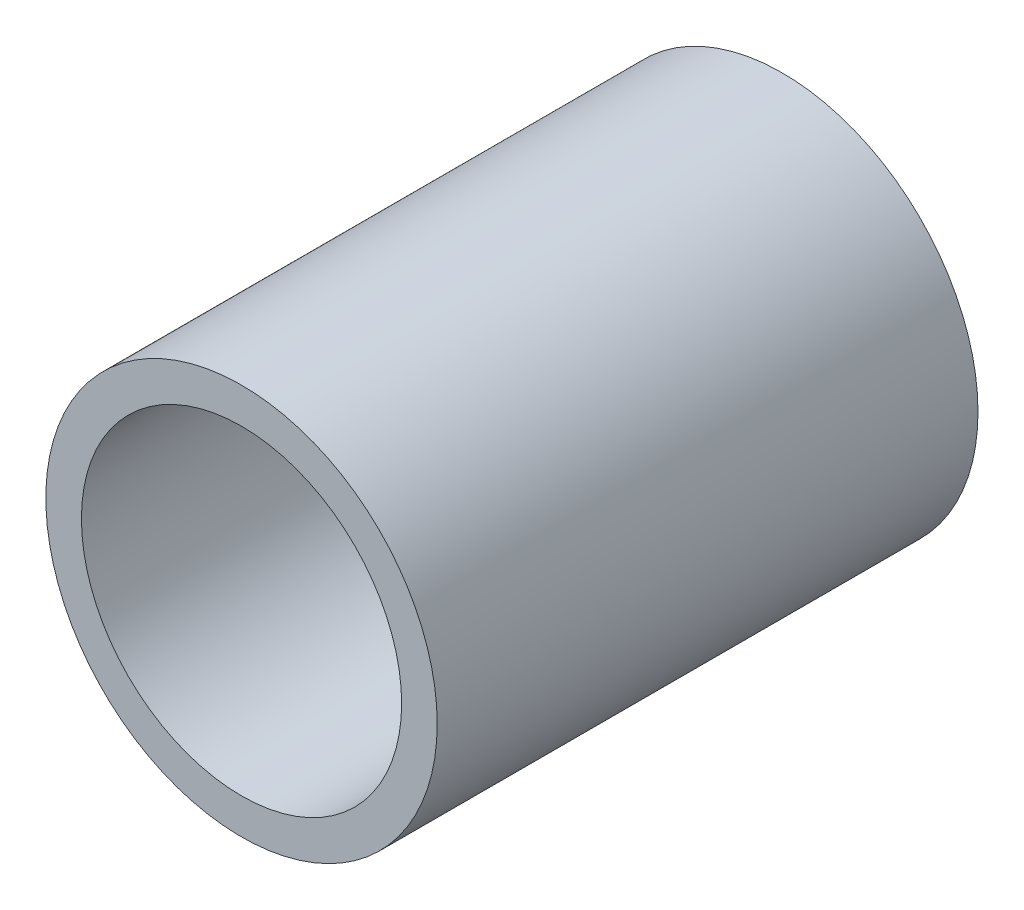
ISO-10303-21;
HEADER;
FILE_DESCRIPTION(('STEP AP214'),'2;1');
FILE_NAME('part.step','',(''),(''),'','','');
FILE_SCHEMA(('AUTOMOTIVE_DESIGN { 1 0 10303 214 1 1 1 1 }'));
ENDSEC;
DATA;
#1=APPLICATION_CONTEXT('core data for automotive mechanical design processes');
#2=APPLICATION_PROTOCOL_DEFINITION('international standard','automotive_design',2000,#1);
#3=PRODUCT_CONTEXT('',#1,'mechanical');
#4=PRODUCT('Part','Part','',(#3));
#5=PRODUCT_RELATED_PRODUCT_CATEGORY('part','',(#4));
#6=PRODUCT_DEFINITION_FORMATION('','',#4);
#7=PRODUCT_DEFINITION_CONTEXT('part definition',#1,'design');
#8=PRODUCT_DEFINITION('design','',#6,#7);
#9=PRODUCT_DEFINITION_SHAPE('','',#8);
#10=(LENGTH_UNIT() NAMED_UNIT(*) SI_UNIT(.MILLI.,.METRE.));
#11=(NAMED_UNIT(*) PLANE_ANGLE_UNIT() SI_UNIT($,.RADIAN.));
#12=(NAMED_UNIT(*) SI_UNIT($,.STERADIAN.) SOLID_ANGLE_UNIT());
#13=UNCERTAINTY_MEASURE_WITH_UNIT(LENGTH_MEASURE(1.E-05),#10,'distance_accuracy_value','');
#14=(GEOMETRIC_REPRESENTATION_CONTEXT(3) GLOBAL_UNCERTAINTY_ASSIGNED_CONTEXT((#13)) GLOBAL_UNIT_ASSIGNED_CONTEXT((#10,
#11,#12)) REPRESENTATION_CONTEXT('',''));
#15=CARTESIAN_POINT('',(0.,0.,0.));
#16=DIRECTION('',(0.,0.,1.));
#17=DIRECTION('',(1.,0.,0.));
#18=AXIS2_PLACEMENT_3D('',#15,#16,#17);
#19=CARTESIAN_POINT('',(0.,0.,-11.4));
#20=DIRECTION('',(0.,0.,1.));
#21=DIRECTION('',(1.,0.,0.));
#22=AXIS2_PLACEMENT_3D('',#19,#20,#21);
#23=CYLINDRICAL_SURFACE('',#22,4.125);
#24=CARTESIAN_POINT('',(0.,0.,-11.4));
#25=DIRECTION('',(0.,0.,1.));
#26=DIRECTION('',(1.,0.,0.));
#27=AXIS2_PLACEMENT_3D('',#24,#25,#26);
#28=CIRCLE('',#27,4.125);
#29=CARTESIAN_POINT('',(4.125,0.,-11.4));
#30=VERTEX_POINT('',#29);
#31=EDGE_CURVE('E10',#30,#30,#28,.T.);
#32=CARTESIAN_POINT('',(0.,0.,0.));
#33=DIRECTION('',(0.,0.,1.));
#34=DIRECTION('',(1.,0.,0.));
#35=AXIS2_PLACEMENT_3D('',#32,#33,#34);
#36=CIRCLE('',#35,4.125);
#37=CARTESIAN_POINT('',(4.125,0.,0.));
#38=VERTEX_POINT('',#37);
#39=EDGE_CURVE('E40',#38,#38,#36,.T.);
#40=CARTESIAN_POINT('',(4.125,0.,-11.4));
#41=CARTESIAN_POINT('',(4.125,0.,-11.28125));
#42=CARTESIAN_POINT('',(4.125,0.,-11.1625));
#43=CARTESIAN_POINT('',(4.125,0.,-10.925));
#44=CARTESIAN_POINT('',(4.125,0.,-10.80625));
#45=CARTESIAN_POINT('',(4.125,0.,-10.56875));
#46=CARTESIAN_POINT('',(4.125,0.,-10.45));
#47=CARTESIAN_POINT('',(4.125,0.,-10.2125));
#48=CARTESIAN_POINT('',(4.125,0.,-10.09375));
#49=CARTESIAN_POINT('',(4.125,0.,-9.85625));
#50=CARTESIAN_POINT('',(4.125,0.,-9.7375));
#51=CARTESIAN_POINT('',(4.125,0.,-9.5));
#52=CARTESIAN_POINT('',(4.125,0.,-9.38125));
#53=CARTESIAN_POINT('',(4.125,0.,-9.14375));
#54=CARTESIAN_POINT('',(4.125,0.,-9.025));
#55=CARTESIAN_POINT('',(4.125,0.,-8.7875));
#56=CARTESIAN_POINT('',(4.125,0.,-8.66875));
#57=CARTESIAN_POINT('',(4.125,0.,-8.43125));
#58=CARTESIAN_POINT('',(4.125,0.,-8.3125));
#59=CARTESIAN_POINT('',(4.125,0.,-8.075));
#60=CARTESIAN_POINT('',(4.125,0.,-7.95625));
#61=CARTESIAN_POINT('',(4.125,0.,-7.71875));
#62=CARTESIAN_POINT('',(4.125,0.,-7.6));
#63=CARTESIAN_POINT('',(4.125,0.,-7.3625));
#64=CARTESIAN_POINT('',(4.125,0.,-7.24375));
#65=CARTESIAN_POINT('',(4.125,0.,-7.00625));
#66=CARTESIAN_POINT('',(4.125,0.,-6.8875));
#67=CARTESIAN_POINT('',(4.125,0.,-6.65));
#68=CARTESIAN_POINT('',(4.125,0.,-6.53125));
#69=CARTESIAN_POINT('',(4.125,0.,-6.29375));
#70=CARTESIAN_POINT('',(4.125,0.,-6.175));
#71=CARTESIAN_POINT('',(4.125,0.,-5.9375));
#72=CARTESIAN_POINT('',(4.125,0.,-5.81875));
#73=CARTESIAN_POINT('',(4.125,0.,-5.58125));
#74=CARTESIAN_POINT('',(4.125,0.,-5.4625));
#75=CARTESIAN_POINT('',(4.125,0.,-5.225));
#76=CARTESIAN_POINT('',(4.125,0.,-5.10625));
#77=CARTESIAN_POINT('',(4.125,0.,-4.86875));
#78=CARTESIAN_POINT('',(4.125,0.,-4.75));
#79=CARTESIAN_POINT('',(4.125,0.,-4.5125));
#80=CARTESIAN_POINT('',(4.125,0.,-4.39375));
#81=CARTESIAN_POINT('',(4.125,0.,-4.15625));
#82=CARTESIAN_POINT('',(4.125,0.,-4.0375));
#83=CARTESIAN_POINT('',(4.125,0.,-3.8));
#84=CARTESIAN_POINT('',(4.125,0.,-3.68125));
#85=CARTESIAN_POINT('',(4.125,0.,-3.44375));
#86=CARTESIAN_POINT('',(4.125,0.,-3.325));
#87=CARTESIAN_POINT('',(4.125,0.,-3.0875));
#88=CARTESIAN_POINT('',(4.125,0.,-2.96875));
#89=CARTESIAN_POINT('',(4.125,0.,-2.73125));
#90=CARTESIAN_POINT('',(4.125,0.,-2.6125));
#91=CARTESIAN_POINT('',(4.125,0.,-2.375));
#92=CARTESIAN_POINT('',(4.125,0.,-2.25625));
#93=CARTESIAN_POINT('',(4.125,0.,-2.01875));
#94=CARTESIAN_POINT('',(4.125,0.,-1.9));
#95=CARTESIAN_POINT('',(4.125,0.,-1.6625));
#96=CARTESIAN_POINT('',(4.125,0.,-1.54375));
#97=CARTESIAN_POINT('',(4.125,0.,-1.30625));
#98=CARTESIAN_POINT('',(4.125,0.,-1.1875));
#99=CARTESIAN_POINT('',(4.125,0.,-0.950000000000002));
#100=CARTESIAN_POINT('',(4.125,0.,-0.831250000000002));
#101=CARTESIAN_POINT('',(4.125,0.,-0.593750000000002));
#102=CARTESIAN_POINT('',(4.125,0.,-0.475000000000002));
#103=CARTESIAN_POINT('',(4.125,0.,-0.237500000000002));
#104=CARTESIAN_POINT('',(4.125,0.,-0.118750000000002));
#105=CARTESIAN_POINT('',(4.125,0.,0.));
#106=B_SPLINE_CURVE_WITH_KNOTS('',3,(#40,#41,#42,#43,#44,#45,#46,#47,#48,#49,#50,#51,#52,#53,
#54,#55,#56,#57,#58,#59,#60,#61,#62,#63,#64,#65,#66,#67,#68,#69,#70,#71,#72,#73,#74,#75,#76,#77,
#78,#79,#80,#81,#82,#83,#84,#85,#86,#87,#88,#89,#90,#91,#92,#93,#94,#95,#96,#97,#98,#99,#100,
#101,#102,#103,#104,#105),.UNSPECIFIED.,.F.,.F.,(4,2,2,2,2,2,2,2,2,2,2,2,2,2,2,2,2,2,2,2,2,2,2,
2,2,2,2,2,2,2,2,2,4),(0.,0.356250000000001,0.712500000000001,1.06875,1.425,1.78125,2.1375,
2.49375,2.85,3.20625,3.5625,3.91875,4.275,4.63125,4.9875,5.34375,5.7,6.05625,6.4125,6.76875,
7.125,7.48125,7.8375,8.19375,8.55,8.90625,9.2625,9.61875,9.975,10.33125,10.6875,11.04375,11.4),.UNSPECIFIED.);
#107=EDGE_CURVE('BSEAM37',#30,#38,#106,.T.);
#108=ORIENTED_EDGE('',*,*,#31,.T.);
#109=ORIENTED_EDGE('',*,*,#39,.F.);
#110=ORIENTED_EDGE('',*,*,#107,.T.);
#111=ORIENTED_EDGE('',*,*,#107,.F.);
#112=EDGE_LOOP('',(#108,#110,#109,#111));
#113=FACE_BOUND('',#112,.T.);
#114=ADVANCED_FACE('F37',(#113),#23,.T.);
#115=CARTESIAN_POINT('',(0.,0.,-11.4));
#116=DIRECTION('',(0.,0.,1.));
#117=DIRECTION('',(1.,0.,0.));
#118=AXIS2_PLACEMENT_3D('',#115,#116,#117);
#119=PLANE('',#118);
#120=CARTESIAN_POINT('',(0.,0.,-11.4));
#121=DIRECTION('',(0.,0.,1.));
#122=DIRECTION('',(1.,0.,0.));
#123=AXIS2_PLACEMENT_3D('',#120,#121,#122);
#124=CIRCLE('',#123,3.375);
#125=CARTESIAN_POINT('',(3.375,0.,-11.4));
#126=VERTEX_POINT('',#125);
#127=EDGE_CURVE('E49',#126,#126,#124,.T.);
#128=ORIENTED_EDGE('',*,*,#127,.T.);
#129=EDGE_LOOP('',(#128));
#130=FACE_BOUND('',#129,.T.);
#131=ORIENTED_EDGE('',*,*,#31,.F.);
#132=EDGE_LOOP('',(#131));
#133=FACE_BOUND('',#132,.T.);
#134=ADVANCED_FACE('F59',(#130,#133),#119,.F.);
#135=CARTESIAN_POINT('',(0.,0.,0.));
#136=DIRECTION('',(0.,0.,1.));
#137=DIRECTION('',(1.,0.,0.));
#138=AXIS2_PLACEMENT_3D('',#135,#136,#137);
#139=PLANE('',#138);
#140=CARTESIAN_POINT('',(0.,0.,0.));
#141=DIRECTION('',(0.,0.,1.));
#142=DIRECTION('',(1.,0.,0.));
#143=AXIS2_PLACEMENT_3D('',#140,#141,#142);
#144=CIRCLE('',#143,3.375);
#145=CARTESIAN_POINT('',(3.375,0.,0.));
#146=VERTEX_POINT('',#145);
#147=EDGE_CURVE('E51',#146,#146,#144,.T.);
#148=ORIENTED_EDGE('',*,*,#147,.F.);
#149=EDGE_LOOP('',(#148));
#150=FACE_BOUND('',#149,.T.);
#151=ORIENTED_EDGE('',*,*,#39,.T.);
#152=EDGE_LOOP('',(#151));
#153=FACE_BOUND('',#152,.T.);
#154=ADVANCED_FACE('F65',(#150,#153),#139,.T.);
#155=CARTESIAN_POINT('',(0.,0.,-11.4));
#156=DIRECTION('',(0.,0.,1.));
#157=DIRECTION('',(1.,0.,0.));
#158=AXIS2_PLACEMENT_3D('',#155,#156,#157);
#159=CYLINDRICAL_SURFACE('',#158,3.375);
#160=CARTESIAN_POINT('',(3.375,0.,-11.4));
#161=CARTESIAN_POINT('',(3.375,0.,-11.28125));
#162=CARTESIAN_POINT('',(3.375,0.,-11.1625));
#163=CARTESIAN_POINT('',(3.375,0.,-10.925));
#164=CARTESIAN_POINT('',(3.375,0.,-10.80625));
#165=CARTESIAN_POINT('',(3.375,0.,-10.56875));
#166=CARTESIAN_POINT('',(3.375,0.,-10.45));
#167=CARTESIAN_POINT('',(3.375,0.,-10.2125));
#168=CARTESIAN_POINT('',(3.375,0.,-10.09375));
#169=CARTESIAN_POINT('',(3.375,0.,-9.85625));
#170=CARTESIAN_POINT('',(3.375,0.,-9.7375));
#171=CARTESIAN_POINT('',(3.375,0.,-9.5));
#172=CARTESIAN_POINT('',(3.375,0.,-9.38125));
#173=CARTESIAN_POINT('',(3.375,0.,-9.14375));
#174=CARTESIAN_POINT('',(3.375,0.,-9.025));
#175=CARTESIAN_POINT('',(3.375,0.,-8.7875));
#176=CARTESIAN_POINT('',(3.375,0.,-8.66875));
#177=CARTESIAN_POINT('',(3.375,0.,-8.43125));
#178=CARTESIAN_POINT('',(3.375,0.,-8.3125));
#179=CARTESIAN_POINT('',(3.375,0.,-8.075));
#180=CARTESIAN_POINT('',(3.375,0.,-7.95625));
#181=CARTESIAN_POINT('',(3.375,0.,-7.71875));
#182=CARTESIAN_POINT('',(3.375,0.,-7.6));
#183=CARTESIAN_POINT('',(3.375,0.,-7.3625));
#184=CARTESIAN_POINT('',(3.375,0.,-7.24375));
#185=CARTESIAN_POINT('',(3.375,0.,-7.00625));
#186=CARTESIAN_POINT('',(3.375,0.,-6.8875));
#187=CARTESIAN_POINT('',(3.375,0.,-6.65));
#188=CARTESIAN_POINT('',(3.375,0.,-6.53125));
#189=CARTESIAN_POINT('',(3.375,0.,-6.29375));
#190=CARTESIAN_POINT('',(3.375,0.,-6.175));
#191=CARTESIAN_POINT('',(3.375,0.,-5.9375));
#192=CARTESIAN_POINT('',(3.375,0.,-5.81875));
#193=CARTESIAN_POINT('',(3.375,0.,-5.58125));
#194=CARTESIAN_POINT('',(3.375,0.,-5.4625));
#195=CARTESIAN_POINT('',(3.375,0.,-5.225));
#196=CARTESIAN_POINT('',(3.375,0.,-5.10625));
#197=CARTESIAN_POINT('',(3.375,0.,-4.86875));
#198=CARTESIAN_POINT('',(3.375,0.,-4.75));
#199=CARTESIAN_POINT('',(3.375,0.,-4.5125));
#200=CARTESIAN_POINT('',(3.375,0.,-4.39375));
#201=CARTESIAN_POINT('',(3.375,0.,-4.15625));
#202=CARTESIAN_POINT('',(3.375,0.,-4.0375));
#203=CARTESIAN_POINT('',(3.375,0.,-3.8));
#204=CARTESIAN_POINT('',(3.375,0.,-3.68125));
#205=CARTESIAN_POINT('',(3.375,0.,-3.44375));
#206=CARTESIAN_POINT('',(3.375,0.,-3.325));
#207=CARTESIAN_POINT('',(3.375,0.,-3.0875));
#208=CARTESIAN_POINT('',(3.375,0.,-2.96875));
#209=CARTESIAN_POINT('',(3.375,0.,-2.73125));
#210=CARTESIAN_POINT('',(3.375,0.,-2.6125));
#211=CARTESIAN_POINT('',(3.375,0.,-2.375));
#212=CARTESIAN_POINT('',(3.375,0.,-2.25625));
#213=CARTESIAN_POINT('',(3.375,0.,-2.01875));
#214=CARTESIAN_POINT('',(3.375,0.,-1.9));
#215=CARTESIAN_POINT('',(3.375,0.,-1.6625));
#216=CARTESIAN_POINT('',(3.375,0.,-1.54375));
#217=CARTESIAN_POINT('',(3.375,0.,-1.30625));
#218=CARTESIAN_POINT('',(3.375,0.,-1.1875));
#219=CARTESIAN_POINT('',(3.375,0.,-0.950000000000002));
#220=CARTESIAN_POINT('',(3.375,0.,-0.831250000000002));
#221=CARTESIAN_POINT('',(3.375,0.,-0.593750000000002));
#222=CARTESIAN_POINT('',(3.375,0.,-0.475000000000002));
#223=CARTESIAN_POINT('',(3.375,0.,-0.237500000000002));
#224=CARTESIAN_POINT('',(3.375,0.,-0.118750000000002));
#225=CARTESIAN_POINT('',(3.375,0.,0.));
#226=B_SPLINE_CURVE_WITH_KNOTS('',3,(#160,#161,#162,#163,#164,#165,#166,#167,#168,#169,#170,
#171,#172,#173,#174,#175,#176,#177,#178,#179,#180,#181,#182,#183,#184,#185,#186,#187,#188,#189,
#190,#191,#192,#193,#194,#195,#196,#197,#198,#199,#200,#201,#202,#203,#204,#205,#206,#207,#208,
#209,#210,#211,#212,#213,#214,#215,#216,#217,#218,#219,#220,#221,#222,#223,#224,#225),
.UNSPECIFIED.,.F.,.F.,(4,2,2,2,2,2,2,2,2,2,2,2,2,2,2,2,2,2,2,2,2,2,2,2,2,2,2,2,2,2,2,2,4),(0.,
0.356249999999999,0.7125,1.06875,1.425,1.78125,2.1375,2.49375,2.85,3.20625,3.5625,3.91875,4.275,
4.63125,4.9875,5.34375,5.7,6.05625,6.4125,6.76875,7.125,7.48125,7.8375,8.19375,8.55,8.90625,
9.2625,9.61875,9.975,10.33125,10.6875,11.04375,11.4),.UNSPECIFIED.);
#227=EDGE_CURVE('BSEAM62',#126,#146,#226,.T.);
#228=ORIENTED_EDGE('',*,*,#127,.F.);
#229=ORIENTED_EDGE('',*,*,#147,.T.);
#230=ORIENTED_EDGE('',*,*,#227,.T.);
#231=ORIENTED_EDGE('',*,*,#227,.F.);
#232=EDGE_LOOP('',(#228,#230,#229,#231));
#233=FACE_BOUND('',#232,.T.);
#234=ADVANCED_FACE('F62',(#233),#159,.F.);
#235=CLOSED_SHELL('',(#114,#134,#154,#234));
#236=MANIFOLD_SOLID_BREP('B2',#235);
#237=ADVANCED_BREP_SHAPE_REPRESENTATION('',(#18,#236),#14);
#238=SHAPE_DEFINITION_REPRESENTATION(#9,#237);
ENDSEC;
END-ISO-10303-21;
